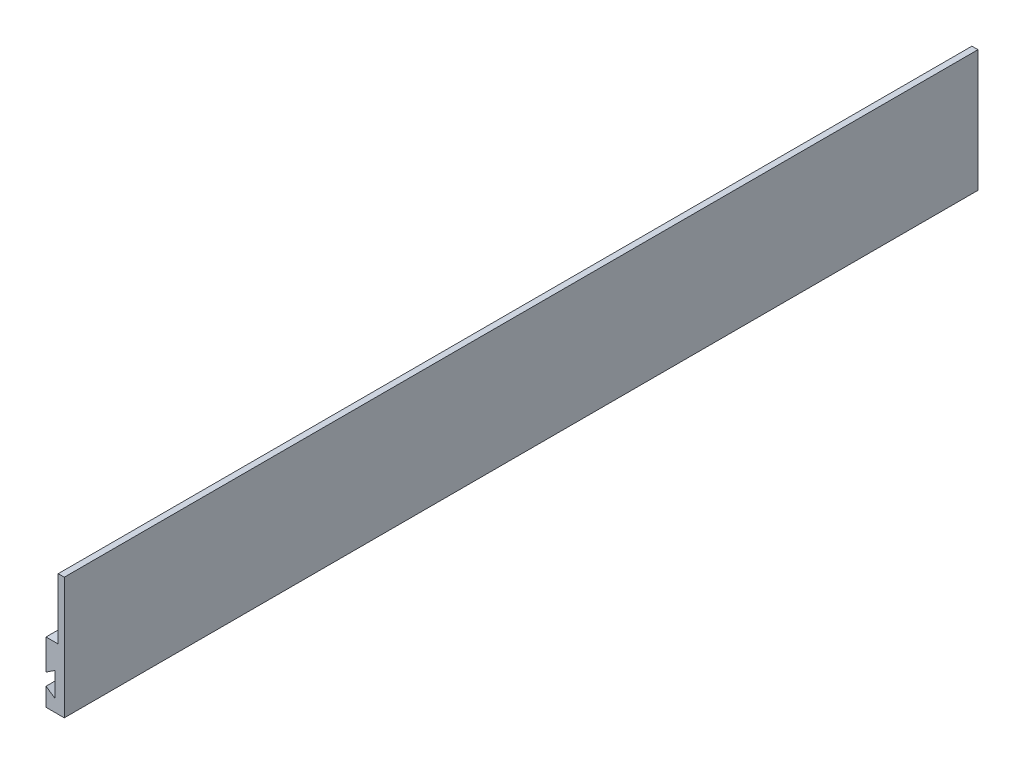
ISO-10303-21;
HEADER;
FILE_DESCRIPTION(('STEP AP214'),'2;1');
FILE_NAME('part.step','',(''),(''),'','','');
FILE_SCHEMA(('AUTOMOTIVE_DESIGN { 1 0 10303 214 1 1 1 1 }'));
ENDSEC;
DATA;
#1=APPLICATION_CONTEXT('core data for automotive mechanical design processes');
#2=APPLICATION_PROTOCOL_DEFINITION('international standard','automotive_design',2000,#1);
#3=PRODUCT_CONTEXT('',#1,'mechanical');
#4=PRODUCT('Part','Part','',(#3));
#5=PRODUCT_RELATED_PRODUCT_CATEGORY('part','',(#4));
#6=PRODUCT_DEFINITION_FORMATION('','',#4);
#7=PRODUCT_DEFINITION_CONTEXT('part definition',#1,'design');
#8=PRODUCT_DEFINITION('design','',#6,#7);
#9=PRODUCT_DEFINITION_SHAPE('','',#8);
#10=(LENGTH_UNIT() NAMED_UNIT(*) SI_UNIT(.MILLI.,.METRE.));
#11=(NAMED_UNIT(*) PLANE_ANGLE_UNIT() SI_UNIT($,.RADIAN.));
#12=(NAMED_UNIT(*) SI_UNIT($,.STERADIAN.) SOLID_ANGLE_UNIT());
#13=UNCERTAINTY_MEASURE_WITH_UNIT(LENGTH_MEASURE(1.E-05),#10,'distance_accuracy_value','');
#14=(GEOMETRIC_REPRESENTATION_CONTEXT(3) GLOBAL_UNCERTAINTY_ASSIGNED_CONTEXT((#13)) GLOBAL_UNIT_ASSIGNED_CONTEXT((#10,
#11,#12)) REPRESENTATION_CONTEXT('',''));
#15=CARTESIAN_POINT('',(0.,0.,0.));
#16=DIRECTION('',(0.,0.,1.));
#17=DIRECTION('',(1.,0.,0.));
#18=AXIS2_PLACEMENT_3D('',#15,#16,#17);
#19=CARTESIAN_POINT('',(15.,100.,1500.));
#20=DIRECTION('',(-1.,0.,0.));
#21=DIRECTION('',(0.,-1.,0.));
#22=AXIS2_PLACEMENT_3D('',#19,#20,#21);
#23=PLANE('',#22);
#24=DIRECTION('',(0.,1.,0.));
#25=VECTOR('',#24,1.);
#26=CARTESIAN_POINT('',(15.,100.,0.));
#27=LINE('',#26,#25);
#28=CARTESIAN_POINT('',(15.,-100.,0.));
#29=VERTEX_POINT('',#28);
#30=CARTESIAN_POINT('',(15.,100.,0.));
#31=VERTEX_POINT('',#30);
#32=EDGE_CURVE('E152',#29,#31,#27,.T.);
#33=ORIENTED_EDGE('',*,*,#32,.T.);
#34=DIRECTION('',(0.,0.,-1.));
#35=VECTOR('',#34,1.);
#36=CARTESIAN_POINT('',(15.,100.,1500.));
#37=LINE('',#36,#35);
#38=CARTESIAN_POINT('',(15.,100.,1500.));
#39=VERTEX_POINT('',#38);
#40=EDGE_CURVE('E11',#39,#31,#37,.T.);
#41=ORIENTED_EDGE('',*,*,#40,.F.);
#42=DIRECTION('',(0.,1.,0.));
#43=VECTOR('',#42,1.);
#44=CARTESIAN_POINT('',(15.,100.,1500.));
#45=LINE('',#44,#43);
#46=CARTESIAN_POINT('',(15.,-100.,1500.));
#47=VERTEX_POINT('',#46);
#48=EDGE_CURVE('E180',#47,#39,#45,.T.);
#49=ORIENTED_EDGE('',*,*,#48,.F.);
#50=DIRECTION('',(0.,0.,-1.));
#51=VECTOR('',#50,1.);
#52=CARTESIAN_POINT('',(15.,-100.,1500.));
#53=LINE('',#52,#51);
#54=EDGE_CURVE('E148',#47,#29,#53,.T.);
#55=ORIENTED_EDGE('',*,*,#54,.T.);
#56=EDGE_LOOP('',(#33,#41,#49,#55));
#57=FACE_BOUND('',#56,.T.);
#58=ADVANCED_FACE('F39',(#57),#23,.F.);
#59=CARTESIAN_POINT('',(4.99999999999998,100.,1500.));
#60=DIRECTION('',(0.,-1.,0.));
#61=DIRECTION('',(0.,0.,-1.));
#62=AXIS2_PLACEMENT_3D('',#59,#60,#61);
#63=PLANE('',#62);
#64=DIRECTION('',(-1.,0.,0.));
#65=VECTOR('',#64,1.);
#66=CARTESIAN_POINT('',(4.99999999999998,100.,0.));
#67=LINE('',#66,#65);
#68=CARTESIAN_POINT('',(4.99999999999998,100.,0.));
#69=VERTEX_POINT('',#68);
#70=EDGE_CURVE('E156',#31,#69,#67,.T.);
#71=ORIENTED_EDGE('',*,*,#70,.T.);
#72=DIRECTION('',(0.,0.,-1.));
#73=VECTOR('',#72,1.);
#74=CARTESIAN_POINT('',(4.99999999999998,100.,1500.));
#75=LINE('',#74,#73);
#76=CARTESIAN_POINT('',(4.99999999999998,100.,1500.));
#77=VERTEX_POINT('',#76);
#78=EDGE_CURVE('E48',#77,#69,#75,.T.);
#79=ORIENTED_EDGE('',*,*,#78,.F.);
#80=DIRECTION('',(-1.,0.,0.));
#81=VECTOR('',#80,1.);
#82=CARTESIAN_POINT('',(4.99999999999998,100.,1500.));
#83=LINE('',#82,#81);
#84=EDGE_CURVE('E105',#39,#77,#83,.T.);
#85=ORIENTED_EDGE('',*,*,#84,.F.);
#86=ORIENTED_EDGE('',*,*,#40,.T.);
#87=EDGE_LOOP('',(#71,#79,#85,#86));
#88=FACE_BOUND('',#87,.T.);
#89=ADVANCED_FACE('F244',(#88),#63,.F.);
#90=CARTESIAN_POINT('',(4.99999999999998,100.,1500.));
#91=DIRECTION('',(1.,0.,0.));
#92=DIRECTION('',(0.,1.,0.));
#93=AXIS2_PLACEMENT_3D('',#90,#91,#92);
#94=PLANE('',#93);
#95=DIRECTION('',(0.,-1.,0.));
#96=VECTOR('',#95,1.);
#97=CARTESIAN_POINT('',(4.99999999999998,100.,0.));
#98=LINE('',#97,#96);
#99=CARTESIAN_POINT('',(4.99999999999999,0.,0.));
#100=VERTEX_POINT('',#99);
#101=EDGE_CURVE('E159',#69,#100,#98,.T.);
#102=ORIENTED_EDGE('',*,*,#101,.T.);
#103=DIRECTION('',(0.,0.,-1.));
#104=VECTOR('',#103,1.);
#105=CARTESIAN_POINT('',(4.99999999999999,0.,1500.));
#106=LINE('',#105,#104);
#107=CARTESIAN_POINT('',(4.99999999999999,0.,1500.));
#108=VERTEX_POINT('',#107);
#109=EDGE_CURVE('E199',#108,#100,#106,.T.);
#110=ORIENTED_EDGE('',*,*,#109,.F.);
#111=DIRECTION('',(0.,-1.,0.));
#112=VECTOR('',#111,1.);
#113=CARTESIAN_POINT('',(4.99999999999998,100.,1500.));
#114=LINE('',#113,#112);
#115=EDGE_CURVE('E209',#77,#108,#114,.T.);
#116=ORIENTED_EDGE('',*,*,#115,.F.);
#117=ORIENTED_EDGE('',*,*,#78,.T.);
#118=EDGE_LOOP('',(#102,#110,#116,#117));
#119=FACE_BOUND('',#118,.T.);
#120=ADVANCED_FACE('F207',(#119),#94,.F.);
#121=CARTESIAN_POINT('',(-15.,0.,1500.));
#122=DIRECTION('',(0.,-1.,0.));
#123=DIRECTION('',(0.,0.,-1.));
#124=AXIS2_PLACEMENT_3D('',#121,#122,#123);
#125=PLANE('',#124);
#126=DIRECTION('',(-1.,0.,0.));
#127=VECTOR('',#126,1.);
#128=CARTESIAN_POINT('',(-15.,0.,0.));
#129=LINE('',#128,#127);
#130=CARTESIAN_POINT('',(-15.,0.,0.));
#131=VERTEX_POINT('',#130);
#132=EDGE_CURVE('E162',#100,#131,#129,.T.);
#133=ORIENTED_EDGE('',*,*,#132,.T.);
#134=DIRECTION('',(0.,0.,-1.));
#135=VECTOR('',#134,1.);
#136=CARTESIAN_POINT('',(-15.,0.,1500.));
#137=LINE('',#136,#135);
#138=CARTESIAN_POINT('',(-15.,0.,1500.));
#139=VERTEX_POINT('',#138);
#140=EDGE_CURVE('E195',#139,#131,#137,.T.);
#141=ORIENTED_EDGE('',*,*,#140,.F.);
#142=DIRECTION('',(-1.,0.,0.));
#143=VECTOR('',#142,1.);
#144=CARTESIAN_POINT('',(-15.,0.,1500.));
#145=LINE('',#144,#143);
#146=EDGE_CURVE('E228',#108,#139,#145,.T.);
#147=ORIENTED_EDGE('',*,*,#146,.F.);
#148=ORIENTED_EDGE('',*,*,#109,.T.);
#149=EDGE_LOOP('',(#133,#141,#147,#148));
#150=FACE_BOUND('',#149,.T.);
#151=ADVANCED_FACE('F218',(#150),#125,.F.);
#152=CARTESIAN_POINT('',(-15.,0.,1500.));
#153=DIRECTION('',(1.,0.,0.));
#154=DIRECTION('',(0.,1.,0.));
#155=AXIS2_PLACEMENT_3D('',#152,#153,#154);
#156=PLANE('',#155);
#157=DIRECTION('',(0.,-1.,0.));
#158=VECTOR('',#157,1.);
#159=CARTESIAN_POINT('',(-15.,0.,0.));
#160=LINE('',#159,#158);
#161=CARTESIAN_POINT('',(-15.,-50.,0.));
#162=VERTEX_POINT('',#161);
#163=EDGE_CURVE('E165',#131,#162,#160,.T.);
#164=ORIENTED_EDGE('',*,*,#163,.T.);
#165=DIRECTION('',(0.,0.,-1.));
#166=VECTOR('',#165,1.);
#167=CARTESIAN_POINT('',(-15.,-50.,1500.));
#168=LINE('',#167,#166);
#169=CARTESIAN_POINT('',(-15.,-50.,1500.));
#170=VERTEX_POINT('',#169);
#171=EDGE_CURVE('E191',#170,#162,#168,.T.);
#172=ORIENTED_EDGE('',*,*,#171,.F.);
#173=DIRECTION('',(0.,-1.,0.));
#174=VECTOR('',#173,1.);
#175=CARTESIAN_POINT('',(-15.,0.,1500.));
#176=LINE('',#175,#174);
#177=EDGE_CURVE('E224',#139,#170,#176,.T.);
#178=ORIENTED_EDGE('',*,*,#177,.F.);
#179=ORIENTED_EDGE('',*,*,#140,.T.);
#180=EDGE_LOOP('',(#164,#172,#178,#179));
#181=FACE_BOUND('',#180,.T.);
#182=ADVANCED_FACE('F222',(#181),#156,.F.);
#183=CARTESIAN_POINT('',(-15.,-50.,1500.));
#184=DIRECTION('',(-0.554700196225229,0.832050294337844,0.));
#185=DIRECTION('',(-0.832050294337844,-0.554700196225229,0.));
#186=AXIS2_PLACEMENT_3D('',#183,#184,#185);
#187=PLANE('',#186);
#188=DIRECTION('',(0.832050294337844,0.554700196225229,0.));
#189=VECTOR('',#188,1.);
#190=CARTESIAN_POINT('',(-15.,-50.,0.));
#191=LINE('',#190,#189);
#192=CARTESIAN_POINT('',(0.,-40.,0.));
#193=VERTEX_POINT('',#192);
#194=EDGE_CURVE('E168',#162,#193,#191,.T.);
#195=ORIENTED_EDGE('',*,*,#194,.T.);
#196=DIRECTION('',(0.,0.,-1.));
#197=VECTOR('',#196,1.);
#198=CARTESIAN_POINT('',(0.,-40.,1500.));
#199=LINE('',#198,#197);
#200=CARTESIAN_POINT('',(0.,-40.,1500.));
#201=VERTEX_POINT('',#200);
#202=EDGE_CURVE('E187',#201,#193,#199,.T.);
#203=ORIENTED_EDGE('',*,*,#202,.F.);
#204=DIRECTION('',(0.832050294337844,0.554700196225229,0.));
#205=VECTOR('',#204,1.);
#206=CARTESIAN_POINT('',(-15.,-50.,1500.));
#207=LINE('',#206,#205);
#208=EDGE_CURVE('E227',#170,#201,#207,.T.);
#209=ORIENTED_EDGE('',*,*,#208,.F.);
#210=ORIENTED_EDGE('',*,*,#171,.T.);
#211=EDGE_LOOP('',(#195,#203,#209,#210));
#212=FACE_BOUND('',#211,.T.);
#213=ADVANCED_FACE('F256',(#212),#187,.F.);
#214=CARTESIAN_POINT('',(0.,-40.,1500.));
#215=DIRECTION('',(1.,0.,0.));
#216=DIRECTION('',(0.,1.,0.));
#217=AXIS2_PLACEMENT_3D('',#214,#215,#216);
#218=PLANE('',#217);
#219=DIRECTION('',(0.,-1.,0.));
#220=VECTOR('',#219,1.);
#221=CARTESIAN_POINT('',(0.,-40.,0.));
#222=LINE('',#221,#220);
#223=CARTESIAN_POINT('',(0.,-80.,0.));
#224=VERTEX_POINT('',#223);
#225=EDGE_CURVE('E171',#193,#224,#222,.T.);
#226=ORIENTED_EDGE('',*,*,#225,.T.);
#227=DIRECTION('',(0.,0.,-1.));
#228=VECTOR('',#227,1.);
#229=CARTESIAN_POINT('',(0.,-80.,1500.));
#230=LINE('',#229,#228);
#231=CARTESIAN_POINT('',(0.,-80.,1500.));
#232=VERTEX_POINT('',#231);
#233=EDGE_CURVE('E141',#232,#224,#230,.T.);
#234=ORIENTED_EDGE('',*,*,#233,.F.);
#235=DIRECTION('',(0.,-1.,0.));
#236=VECTOR('',#235,1.);
#237=CARTESIAN_POINT('',(0.,-40.,1500.));
#238=LINE('',#237,#236);
#239=EDGE_CURVE('E130',#201,#232,#238,.T.);
#240=ORIENTED_EDGE('',*,*,#239,.F.);
#241=ORIENTED_EDGE('',*,*,#202,.T.);
#242=EDGE_LOOP('',(#226,#234,#240,#241));
#243=FACE_BOUND('',#242,.T.);
#244=ADVANCED_FACE('F259',(#243),#218,.F.);
#245=CARTESIAN_POINT('',(0.,-80.,1500.));
#246=DIRECTION('',(-0.554700196225229,-0.832050294337844,0.));
#247=DIRECTION('',(0.832050294337844,-0.554700196225229,0.));
#248=AXIS2_PLACEMENT_3D('',#245,#246,#247);
#249=PLANE('',#248);
#250=DIRECTION('',(-0.832050294337844,0.554700196225229,0.));
#251=VECTOR('',#250,1.);
#252=CARTESIAN_POINT('',(0.,-80.,0.));
#253=LINE('',#252,#251);
#254=CARTESIAN_POINT('',(-15.,-70.,0.));
#255=VERTEX_POINT('',#254);
#256=EDGE_CURVE('E139',#224,#255,#253,.T.);
#257=ORIENTED_EDGE('',*,*,#256,.T.);
#258=DIRECTION('',(0.,0.,-1.));
#259=VECTOR('',#258,1.);
#260=CARTESIAN_POINT('',(-15.,-70.,1500.));
#261=LINE('',#260,#259);
#262=CARTESIAN_POINT('',(-15.,-70.,1500.));
#263=VERTEX_POINT('',#262);
#264=EDGE_CURVE('E136',#263,#255,#261,.T.);
#265=ORIENTED_EDGE('',*,*,#264,.F.);
#266=DIRECTION('',(-0.832050294337844,0.554700196225229,0.));
#267=VECTOR('',#266,1.);
#268=CARTESIAN_POINT('',(0.,-80.,1500.));
#269=LINE('',#268,#267);
#270=EDGE_CURVE('E124',#232,#263,#269,.T.);
#271=ORIENTED_EDGE('',*,*,#270,.F.);
#272=ORIENTED_EDGE('',*,*,#233,.T.);
#273=EDGE_LOOP('',(#257,#265,#271,#272));
#274=FACE_BOUND('',#273,.T.);
#275=ADVANCED_FACE('F137',(#274),#249,.F.);
#276=CARTESIAN_POINT('',(-15.,-70.,1500.));
#277=DIRECTION('',(1.,0.,0.));
#278=DIRECTION('',(0.,1.,0.));
#279=AXIS2_PLACEMENT_3D('',#276,#277,#278);
#280=PLANE('',#279);
#281=DIRECTION('',(0.,-1.,0.));
#282=VECTOR('',#281,1.);
#283=CARTESIAN_POINT('',(-15.,-70.,0.));
#284=LINE('',#283,#282);
#285=CARTESIAN_POINT('',(-15.,-100.,0.));
#286=VERTEX_POINT('',#285);
#287=EDGE_CURVE('E91',#255,#286,#284,.T.);
#288=ORIENTED_EDGE('',*,*,#287,.T.);
#289=DIRECTION('',(0.,0.,-1.));
#290=VECTOR('',#289,1.);
#291=CARTESIAN_POINT('',(-15.,-100.,1500.));
#292=LINE('',#291,#290);
#293=CARTESIAN_POINT('',(-15.,-100.,1500.));
#294=VERTEX_POINT('',#293);
#295=EDGE_CURVE('E142',#294,#286,#292,.T.);
#296=ORIENTED_EDGE('',*,*,#295,.F.);
#297=DIRECTION('',(0.,-1.,0.));
#298=VECTOR('',#297,1.);
#299=CARTESIAN_POINT('',(-15.,-70.,1500.));
#300=LINE('',#299,#298);
#301=EDGE_CURVE('E128',#263,#294,#300,.T.);
#302=ORIENTED_EDGE('',*,*,#301,.F.);
#303=ORIENTED_EDGE('',*,*,#264,.T.);
#304=EDGE_LOOP('',(#288,#296,#302,#303));
#305=FACE_BOUND('',#304,.T.);
#306=ADVANCED_FACE('F144',(#305),#280,.F.);
#307=CARTESIAN_POINT('',(-15.,-100.,1500.));
#308=DIRECTION('',(0.,1.,0.));
#309=DIRECTION('',(0.,0.,1.));
#310=AXIS2_PLACEMENT_3D('',#307,#308,#309);
#311=PLANE('',#310);
#312=DIRECTION('',(1.,0.,0.));
#313=VECTOR('',#312,1.);
#314=CARTESIAN_POINT('',(-15.,-100.,0.));
#315=LINE('',#314,#313);
#316=EDGE_CURVE('E97',#286,#29,#315,.T.);
#317=ORIENTED_EDGE('',*,*,#316,.T.);
#318=ORIENTED_EDGE('',*,*,#54,.F.);
#319=DIRECTION('',(1.,0.,0.));
#320=VECTOR('',#319,1.);
#321=CARTESIAN_POINT('',(-15.,-100.,1500.));
#322=LINE('',#321,#320);
#323=EDGE_CURVE('E56',#294,#47,#322,.T.);
#324=ORIENTED_EDGE('',*,*,#323,.F.);
#325=ORIENTED_EDGE('',*,*,#295,.T.);
#326=EDGE_LOOP('',(#317,#318,#324,#325));
#327=FACE_BOUND('',#326,.T.);
#328=ADVANCED_FACE('F268',(#327),#311,.F.);
#329=CARTESIAN_POINT('',(0.,0.,1500.));
#330=DIRECTION('',(0.,0.,1.));
#331=DIRECTION('',(1.,0.,0.));
#332=AXIS2_PLACEMENT_3D('',#329,#330,#331);
#333=PLANE('',#332);
#334=ORIENTED_EDGE('',*,*,#48,.T.);
#335=ORIENTED_EDGE('',*,*,#84,.T.);
#336=ORIENTED_EDGE('',*,*,#115,.T.);
#337=ORIENTED_EDGE('',*,*,#146,.T.);
#338=ORIENTED_EDGE('',*,*,#177,.T.);
#339=ORIENTED_EDGE('',*,*,#208,.T.);
#340=ORIENTED_EDGE('',*,*,#239,.T.);
#341=ORIENTED_EDGE('',*,*,#270,.T.);
#342=ORIENTED_EDGE('',*,*,#301,.T.);
#343=ORIENTED_EDGE('',*,*,#323,.T.);
#344=EDGE_LOOP('',(#334,#335,#336,#337,#338,#339,#340,#341,#342,#343));
#345=FACE_BOUND('',#344,.T.);
#346=ADVANCED_FACE('F126',(#345),#333,.T.);
#347=CARTESIAN_POINT('',(0.,0.,0.));
#348=DIRECTION('',(0.,0.,1.));
#349=DIRECTION('',(1.,0.,0.));
#350=AXIS2_PLACEMENT_3D('',#347,#348,#349);
#351=PLANE('',#350);
#352=ORIENTED_EDGE('',*,*,#32,.F.);
#353=ORIENTED_EDGE('',*,*,#316,.F.);
#354=ORIENTED_EDGE('',*,*,#287,.F.);
#355=ORIENTED_EDGE('',*,*,#256,.F.);
#356=ORIENTED_EDGE('',*,*,#225,.F.);
#357=ORIENTED_EDGE('',*,*,#194,.F.);
#358=ORIENTED_EDGE('',*,*,#163,.F.);
#359=ORIENTED_EDGE('',*,*,#132,.F.);
#360=ORIENTED_EDGE('',*,*,#101,.F.);
#361=ORIENTED_EDGE('',*,*,#70,.F.);
#362=EDGE_LOOP('',(#352,#353,#354,#355,#356,#357,#358,#359,#360,#361));
#363=FACE_BOUND('',#362,.T.);
#364=ADVANCED_FACE('F213',(#363),#351,.F.);
#365=CLOSED_SHELL('',(#58,#89,#120,#151,#182,#213,#244,#275,#306,#328,#346,#364));
#366=MANIFOLD_SOLID_BREP('B2',#365);
#367=ADVANCED_BREP_SHAPE_REPRESENTATION('',(#18,#366),#14);
#368=SHAPE_DEFINITION_REPRESENTATION(#9,#367);
ENDSEC;
END-ISO-10303-21;
